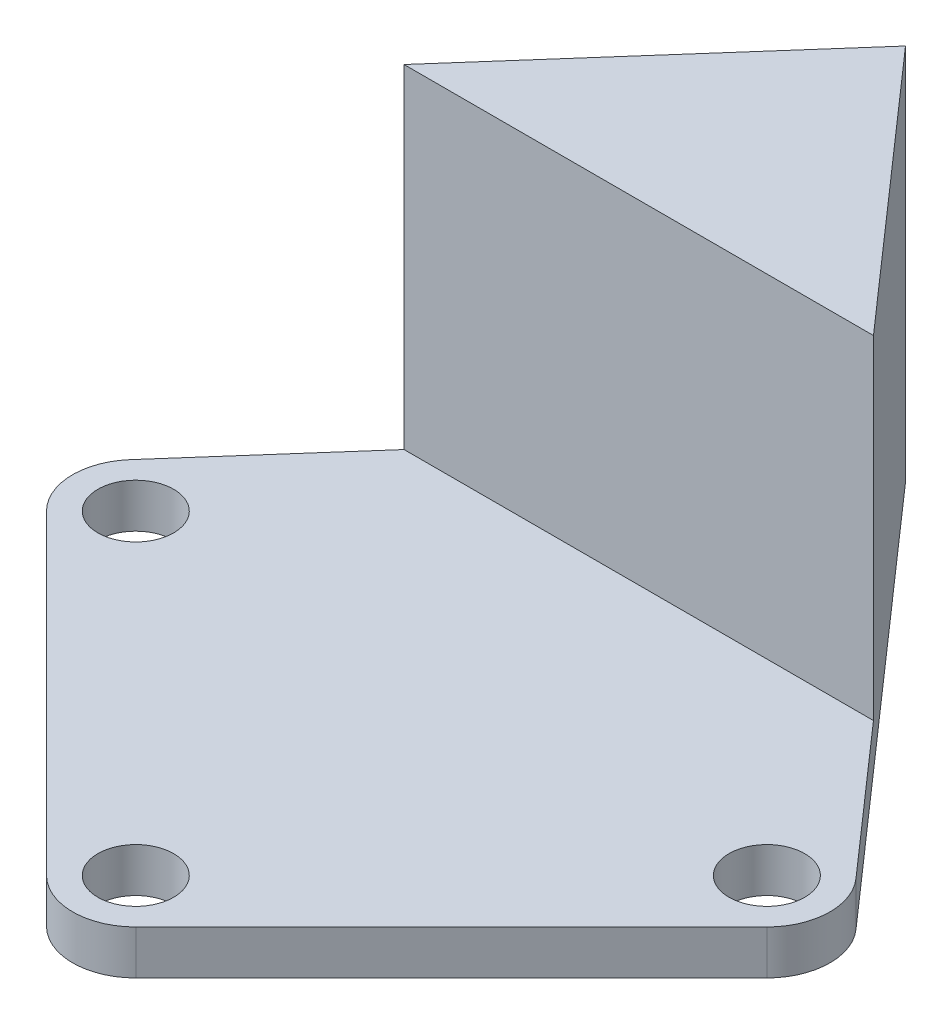
ISO-10303-21;
HEADER;
FILE_DESCRIPTION(('STEP AP214'),'2;1');
FILE_NAME('part.step','',(''),(''),'','','');
FILE_SCHEMA(('AUTOMOTIVE_DESIGN { 1 0 10303 214 1 1 1 1 }'));
ENDSEC;
DATA;
#1=APPLICATION_CONTEXT('core data for automotive mechanical design processes');
#2=APPLICATION_PROTOCOL_DEFINITION('international standard','automotive_design',2000,#1);
#3=PRODUCT_CONTEXT('',#1,'mechanical');
#4=PRODUCT('Part','Part','',(#3));
#5=PRODUCT_RELATED_PRODUCT_CATEGORY('part','',(#4));
#6=PRODUCT_DEFINITION_FORMATION('','',#4);
#7=PRODUCT_DEFINITION_CONTEXT('part definition',#1,'design');
#8=PRODUCT_DEFINITION('design','',#6,#7);
#9=PRODUCT_DEFINITION_SHAPE('','',#8);
#10=(LENGTH_UNIT() NAMED_UNIT(*) SI_UNIT(.MILLI.,.METRE.));
#11=(NAMED_UNIT(*) PLANE_ANGLE_UNIT() SI_UNIT($,.RADIAN.));
#12=(NAMED_UNIT(*) SI_UNIT($,.STERADIAN.) SOLID_ANGLE_UNIT());
#13=UNCERTAINTY_MEASURE_WITH_UNIT(LENGTH_MEASURE(1.E-05),#10,'distance_accuracy_value','');
#14=(GEOMETRIC_REPRESENTATION_CONTEXT(3) GLOBAL_UNCERTAINTY_ASSIGNED_CONTEXT((#13)) GLOBAL_UNIT_ASSIGNED_CONTEXT((#10,
#11,#12)) REPRESENTATION_CONTEXT('',''));
#15=CARTESIAN_POINT('',(0.,0.,0.));
#16=DIRECTION('',(0.,0.,1.));
#17=DIRECTION('',(1.,0.,0.));
#18=AXIS2_PLACEMENT_3D('',#15,#16,#17);
#19=CARTESIAN_POINT('',(0.,3.5,0.));
#20=DIRECTION('',(0.,1.,0.));
#21=DIRECTION('',(0.,0.,1.));
#22=AXIS2_PLACEMENT_3D('',#19,#20,#21);
#23=PLANE('',#22);
#24=CARTESIAN_POINT('',(-25.,3.5,0.));
#25=DIRECTION('',(0.,1.,0.));
#26=DIRECTION('',(0.,0.,1.));
#27=AXIS2_PLACEMENT_3D('',#24,#25,#26);
#28=CIRCLE('',#27,3.);
#29=CARTESIAN_POINT('',(-25.,3.5,3.));
#30=VERTEX_POINT('',#29);
#31=EDGE_CURVE('E181',#30,#30,#28,.T.);
#32=ORIENTED_EDGE('',*,*,#31,.F.);
#33=EDGE_LOOP('',(#32));
#34=FACE_BOUND('',#33,.T.);
#35=CARTESIAN_POINT('',(25.,3.5,0.));
#36=DIRECTION('',(0.,1.,0.));
#37=DIRECTION('',(0.,0.,1.));
#38=AXIS2_PLACEMENT_3D('',#35,#36,#37);
#39=CIRCLE('',#38,3.);
#40=CARTESIAN_POINT('',(25.,3.5,3.));
#41=VERTEX_POINT('',#40);
#42=EDGE_CURVE('E184',#41,#41,#39,.T.);
#43=ORIENTED_EDGE('',*,*,#42,.F.);
#44=EDGE_LOOP('',(#43));
#45=FACE_BOUND('',#44,.T.);
#46=CARTESIAN_POINT('',(0.,3.5,25.));
#47=DIRECTION('',(0.,1.,0.));
#48=DIRECTION('',(0.,0.,1.));
#49=AXIS2_PLACEMENT_3D('',#46,#47,#48);
#50=CIRCLE('',#49,3.);
#51=CARTESIAN_POINT('',(0.,3.5,28.));
#52=VERTEX_POINT('',#51);
#53=EDGE_CURVE('E187',#52,#52,#50,.T.);
#54=ORIENTED_EDGE('',*,*,#53,.F.);
#55=EDGE_LOOP('',(#54));
#56=FACE_BOUND('',#55,.T.);
#57=DIRECTION('',(0.660580910670077,0.,0.75075486042935));
#58=VECTOR('',#57,1.);
#59=CARTESIAN_POINT('',(17.8445958136041,3.5,-15.7012627881605));
#60=LINE('',#59,#58);
#61=CARTESIAN_POINT('',(18.594331137902,3.5,-14.8491833083262));
#62=VERTEX_POINT('',#61);
#63=CARTESIAN_POINT('',(28.7537743021467,3.5,-3.30290455335038));
#64=VERTEX_POINT('',#63);
#65=EDGE_CURVE('E174',#62,#64,#60,.T.);
#66=ORIENTED_EDGE('',*,*,#65,.F.);
#67=DIRECTION('',(-1.,0.,0.));
#68=VECTOR('',#67,1.);
#69=CARTESIAN_POINT('',(0.,3.5,-14.8491833083262));
#70=LINE('',#69,#68);
#71=CARTESIAN_POINT('',(-18.594331137902,3.50000000000001,-14.8491833083262));
#72=VERTEX_POINT('',#71);
#73=EDGE_CURVE('E158',#62,#72,#70,.T.);
#74=ORIENTED_EDGE('',*,*,#73,.T.);
#75=DIRECTION('',(0.660580910670077,0.,-0.75075486042935));
#76=VECTOR('',#75,1.);
#77=CARTESIAN_POINT('',(-17.8445958136041,3.5,-15.7012627881605));
#78=LINE('',#77,#76);
#79=CARTESIAN_POINT('',(-28.7537743021467,3.5,-3.30290455335038));
#80=VERTEX_POINT('',#79);
#81=EDGE_CURVE('E176',#80,#72,#78,.T.);
#82=ORIENTED_EDGE('',*,*,#81,.F.);
#83=CARTESIAN_POINT('',(-25.,3.5,0.));
#84=DIRECTION('',(0.,1.,0.));
#85=DIRECTION('',(0.,0.,1.));
#86=AXIS2_PLACEMENT_3D('',#83,#84,#85);
#87=CIRCLE('',#86,5.);
#88=CARTESIAN_POINT('',(-28.5355339059327,3.5,3.53553390593273));
#89=VERTEX_POINT('',#88);
#90=EDGE_CURVE('E179',#80,#89,#87,.T.);
#91=ORIENTED_EDGE('',*,*,#90,.T.);
#92=DIRECTION('',(-0.707106781186548,0.,-0.707106781186548));
#93=VECTOR('',#92,1.);
#94=CARTESIAN_POINT('',(-16.0355339059327,3.5,16.0355339059327));
#95=LINE('',#94,#93);
#96=CARTESIAN_POINT('',(-3.53553390593274,3.5,28.5355339059327));
#97=VERTEX_POINT('',#96);
#98=EDGE_CURVE('E162',#97,#89,#95,.T.);
#99=ORIENTED_EDGE('',*,*,#98,.F.);
#100=CARTESIAN_POINT('',(0.,3.5,25.));
#101=DIRECTION('',(0.,1.,0.));
#102=DIRECTION('',(0.,0.,1.));
#103=AXIS2_PLACEMENT_3D('',#100,#101,#102);
#104=CIRCLE('',#103,5.);
#105=CARTESIAN_POINT('',(3.53553390593274,3.5,28.5355339059327));
#106=VERTEX_POINT('',#105);
#107=EDGE_CURVE('E165',#97,#106,#104,.T.);
#108=ORIENTED_EDGE('',*,*,#107,.T.);
#109=DIRECTION('',(-0.707106781186548,0.,0.707106781186548));
#110=VECTOR('',#109,1.);
#111=CARTESIAN_POINT('',(16.0355339059327,3.5,16.0355339059327));
#112=LINE('',#111,#110);
#113=CARTESIAN_POINT('',(28.5355339059327,3.5,3.53553390593274));
#114=VERTEX_POINT('',#113);
#115=EDGE_CURVE('E168',#114,#106,#112,.T.);
#116=ORIENTED_EDGE('',*,*,#115,.F.);
#117=CARTESIAN_POINT('',(25.,3.5,0.));
#118=DIRECTION('',(0.,1.,0.));
#119=DIRECTION('',(0.,0.,1.));
#120=AXIS2_PLACEMENT_3D('',#117,#118,#119);
#121=CIRCLE('',#120,5.);
#122=EDGE_CURVE('E171',#114,#64,#121,.T.);
#123=ORIENTED_EDGE('',*,*,#122,.T.);
#124=EDGE_LOOP('',(#66,#74,#82,#91,#99,#108,#116,#123));
#125=FACE_BOUND('',#124,.T.);
#126=ADVANCED_FACE('F35',(#34,#45,#56,#125),#23,.T.);
#127=CARTESIAN_POINT('',(-16.0355339059327,3.5,16.0355339059327));
#128=DIRECTION('',(-0.707106781186547,0.,0.707106781186547));
#129=DIRECTION('',(0.707106781186548,0.,0.707106781186548));
#130=AXIS2_PLACEMENT_3D('',#127,#128,#129);
#131=PLANE('',#130);
#132=DIRECTION('',(-0.707106781186548,0.,-0.707106781186548));
#133=VECTOR('',#132,1.);
#134=CARTESIAN_POINT('',(-16.0355339059327,0.,16.0355339059327));
#135=LINE('',#134,#133);
#136=CARTESIAN_POINT('',(-3.53553390593274,0.,28.5355339059327));
#137=VERTEX_POINT('',#136);
#138=CARTESIAN_POINT('',(-28.5355339059327,0.,3.53553390593273));
#139=VERTEX_POINT('',#138);
#140=EDGE_CURVE('E161',#137,#139,#135,.T.);
#141=ORIENTED_EDGE('',*,*,#140,.F.);
#142=DIRECTION('',(0.,-1.,0.));
#143=VECTOR('',#142,1.);
#144=CARTESIAN_POINT('',(-3.53553390593274,3.5,28.5355339059327));
#145=LINE('',#144,#143);
#146=EDGE_CURVE('E230',#97,#137,#145,.T.);
#147=ORIENTED_EDGE('',*,*,#146,.F.);
#148=ORIENTED_EDGE('',*,*,#98,.T.);
#149=DIRECTION('',(0.,-1.,0.));
#150=VECTOR('',#149,1.);
#151=CARTESIAN_POINT('',(-28.5355339059327,3.5,3.53553390593273));
#152=LINE('',#151,#150);
#153=EDGE_CURVE('E190',#89,#139,#152,.T.);
#154=ORIENTED_EDGE('',*,*,#153,.T.);
#155=EDGE_LOOP('',(#141,#147,#148,#154));
#156=FACE_BOUND('',#155,.T.);
#157=ADVANCED_FACE('F37',(#156),#131,.T.);
#158=CARTESIAN_POINT('',(0.,3.5,25.));
#159=DIRECTION('',(0.,-1.,0.));
#160=DIRECTION('',(0.,0.,-1.));
#161=AXIS2_PLACEMENT_3D('',#158,#159,#160);
#162=CYLINDRICAL_SURFACE('',#161,5.);
#163=CARTESIAN_POINT('',(0.,0.,25.));
#164=DIRECTION('',(0.,1.,0.));
#165=DIRECTION('',(0.,0.,1.));
#166=AXIS2_PLACEMENT_3D('',#163,#164,#165);
#167=CIRCLE('',#166,5.);
#168=CARTESIAN_POINT('',(3.53553390593274,0.,28.5355339059327));
#169=VERTEX_POINT('',#168);
#170=EDGE_CURVE('E193',#137,#169,#167,.T.);
#171=ORIENTED_EDGE('',*,*,#170,.T.);
#172=DIRECTION('',(0.,-1.,0.));
#173=VECTOR('',#172,1.);
#174=CARTESIAN_POINT('',(3.53553390593274,3.5,28.5355339059327));
#175=LINE('',#174,#173);
#176=EDGE_CURVE('E228',#106,#169,#175,.T.);
#177=ORIENTED_EDGE('',*,*,#176,.F.);
#178=ORIENTED_EDGE('',*,*,#107,.F.);
#179=ORIENTED_EDGE('',*,*,#146,.T.);
#180=EDGE_LOOP('',(#171,#177,#178,#179));
#181=FACE_BOUND('',#180,.T.);
#182=ADVANCED_FACE('F254',(#181),#162,.T.);
#183=CARTESIAN_POINT('',(16.0355339059327,3.5,16.0355339059327));
#184=DIRECTION('',(0.707106781186547,0.,0.707106781186547));
#185=DIRECTION('',(0.707106781186548,0.,-0.707106781186548));
#186=AXIS2_PLACEMENT_3D('',#183,#184,#185);
#187=PLANE('',#186);
#188=DIRECTION('',(-0.707106781186548,0.,0.707106781186548));
#189=VECTOR('',#188,1.);
#190=CARTESIAN_POINT('',(16.0355339059327,0.,16.0355339059327));
#191=LINE('',#190,#189);
#192=CARTESIAN_POINT('',(28.5355339059327,0.,3.53553390593274));
#193=VERTEX_POINT('',#192);
#194=EDGE_CURVE('E196',#193,#169,#191,.T.);
#195=ORIENTED_EDGE('',*,*,#194,.F.);
#196=DIRECTION('',(0.,-1.,0.));
#197=VECTOR('',#196,1.);
#198=CARTESIAN_POINT('',(28.5355339059327,3.5,3.53553390593274));
#199=LINE('',#198,#197);
#200=EDGE_CURVE('E226',#114,#193,#199,.T.);
#201=ORIENTED_EDGE('',*,*,#200,.F.);
#202=ORIENTED_EDGE('',*,*,#115,.T.);
#203=ORIENTED_EDGE('',*,*,#176,.T.);
#204=EDGE_LOOP('',(#195,#201,#202,#203));
#205=FACE_BOUND('',#204,.T.);
#206=ADVANCED_FACE('F290',(#205),#187,.T.);
#207=CARTESIAN_POINT('',(25.,3.5,0.));
#208=DIRECTION('',(0.,-1.,0.));
#209=DIRECTION('',(0.,0.,-1.));
#210=AXIS2_PLACEMENT_3D('',#207,#208,#209);
#211=CYLINDRICAL_SURFACE('',#210,5.);
#212=CARTESIAN_POINT('',(25.,0.,0.));
#213=DIRECTION('',(0.,1.,0.));
#214=DIRECTION('',(0.,0.,1.));
#215=AXIS2_PLACEMENT_3D('',#212,#213,#214);
#216=CIRCLE('',#215,5.);
#217=CARTESIAN_POINT('',(28.7537743021467,0.,-3.30290455335038));
#218=VERTEX_POINT('',#217);
#219=EDGE_CURVE('E199',#193,#218,#216,.T.);
#220=ORIENTED_EDGE('',*,*,#219,.T.);
#221=DIRECTION('',(0.,-1.,0.));
#222=VECTOR('',#221,1.);
#223=CARTESIAN_POINT('',(28.7537743021467,3.5,-3.30290455335038));
#224=LINE('',#223,#222);
#225=EDGE_CURVE('E223',#64,#218,#224,.T.);
#226=ORIENTED_EDGE('',*,*,#225,.F.);
#227=ORIENTED_EDGE('',*,*,#122,.F.);
#228=ORIENTED_EDGE('',*,*,#200,.T.);
#229=EDGE_LOOP('',(#220,#226,#227,#228));
#230=FACE_BOUND('',#229,.T.);
#231=ADVANCED_FACE('F287',(#230),#211,.T.);
#232=CARTESIAN_POINT('',(17.8445958136041,3.5,-15.7012627881605));
#233=DIRECTION('',(0.75075486042935,0.,-0.660580910670077));
#234=DIRECTION('',(-0.660580910670077,0.,-0.75075486042935));
#235=AXIS2_PLACEMENT_3D('',#232,#233,#234);
#236=PLANE('',#235);
#237=DIRECTION('',(0.,-1.,0.));
#238=VECTOR('',#237,1.);
#239=CARTESIAN_POINT('',(18.594331137902,29.918114597563,-14.8491833083262));
#240=LINE('',#239,#238);
#241=CARTESIAN_POINT('',(18.594331137902,29.918114597563,-14.8491833083262));
#242=VERTEX_POINT('',#241);
#243=EDGE_CURVE('E58',#242,#62,#240,.T.);
#244=ORIENTED_EDGE('',*,*,#243,.T.);
#245=ORIENTED_EDGE('',*,*,#65,.T.);
#246=ORIENTED_EDGE('',*,*,#225,.T.);
#247=DIRECTION('',(0.660580910670077,0.,0.75075486042935));
#248=VECTOR('',#247,1.);
#249=CARTESIAN_POINT('',(17.8445958136041,0.,-15.7012627881605));
#250=LINE('',#249,#248);
#251=CARTESIAN_POINT('',(0.,0.,-35.9817716903493));
#252=VERTEX_POINT('',#251);
#253=EDGE_CURVE('E202',#252,#218,#250,.T.);
#254=ORIENTED_EDGE('',*,*,#253,.F.);
#255=DIRECTION('',(0.,-1.,0.));
#256=VECTOR('',#255,1.);
#257=CARTESIAN_POINT('',(0.,3.5,-35.9817716903493));
#258=LINE('',#257,#256);
#259=CARTESIAN_POINT('',(0.,29.918114597563,-35.9817716903493));
#260=VERTEX_POINT('',#259);
#261=EDGE_CURVE('E220',#260,#252,#258,.T.);
#262=ORIENTED_EDGE('',*,*,#261,.F.);
#263=DIRECTION('',(0.660580910670077,0.,0.75075486042935));
#264=VECTOR('',#263,1.);
#265=CARTESIAN_POINT('',(17.8445958136041,29.918114597563,-15.7012627881605));
#266=LINE('',#265,#264);
#267=EDGE_CURVE('E153',#260,#242,#266,.T.);
#268=ORIENTED_EDGE('',*,*,#267,.T.);
#269=EDGE_LOOP('',(#244,#245,#246,#254,#262,#268));
#270=FACE_BOUND('',#269,.T.);
#271=ADVANCED_FACE('F283',(#270),#236,.T.);
#272=CARTESIAN_POINT('',(-17.8445958136041,3.5,-15.7012627881605));
#273=DIRECTION('',(-0.75075486042935,0.,-0.660580910670077));
#274=DIRECTION('',(-0.660580910670077,0.,0.75075486042935));
#275=AXIS2_PLACEMENT_3D('',#272,#273,#274);
#276=PLANE('',#275);
#277=ORIENTED_EDGE('',*,*,#261,.T.);
#278=DIRECTION('',(0.660580910670077,0.,-0.75075486042935));
#279=VECTOR('',#278,1.);
#280=CARTESIAN_POINT('',(-17.8445958136041,0.,-15.7012627881605));
#281=LINE('',#280,#279);
#282=CARTESIAN_POINT('',(-28.7537743021467,0.,-3.30290455335038));
#283=VERTEX_POINT('',#282);
#284=EDGE_CURVE('E204',#283,#252,#281,.T.);
#285=ORIENTED_EDGE('',*,*,#284,.F.);
#286=DIRECTION('',(0.,-1.,0.));
#287=VECTOR('',#286,1.);
#288=CARTESIAN_POINT('',(-28.7537743021467,3.5,-3.30290455335038));
#289=LINE('',#288,#287);
#290=EDGE_CURVE('E218',#80,#283,#289,.T.);
#291=ORIENTED_EDGE('',*,*,#290,.F.);
#292=ORIENTED_EDGE('',*,*,#81,.T.);
#293=DIRECTION('',(0.,-1.,0.));
#294=VECTOR('',#293,1.);
#295=CARTESIAN_POINT('',(-18.594331137902,29.918114597563,-14.8491833083262));
#296=LINE('',#295,#294);
#297=CARTESIAN_POINT('',(-18.594331137902,29.918114597563,-14.8491833083262));
#298=VERTEX_POINT('',#297);
#299=EDGE_CURVE('E156',#298,#72,#296,.T.);
#300=ORIENTED_EDGE('',*,*,#299,.F.);
#301=DIRECTION('',(0.660580910670077,0.,-0.75075486042935));
#302=VECTOR('',#301,1.);
#303=CARTESIAN_POINT('',(-17.8445958136041,29.918114597563,-15.7012627881605));
#304=LINE('',#303,#302);
#305=EDGE_CURVE('E147',#298,#260,#304,.T.);
#306=ORIENTED_EDGE('',*,*,#305,.T.);
#307=EDGE_LOOP('',(#277,#285,#291,#292,#300,#306));
#308=FACE_BOUND('',#307,.T.);
#309=ADVANCED_FACE('F273',(#308),#276,.T.);
#310=CARTESIAN_POINT('',(25.,3.5,0.));
#311=DIRECTION('',(0.,-1.,0.));
#312=DIRECTION('',(0.,0.,-1.));
#313=AXIS2_PLACEMENT_3D('',#310,#311,#312);
#314=CYLINDRICAL_SURFACE('',#313,3.);
#315=ORIENTED_EDGE('',*,*,#42,.T.);
#316=EDGE_LOOP('',(#315));
#317=FACE_BOUND('',#316,.T.);
#318=CARTESIAN_POINT('',(25.,0.,0.));
#319=DIRECTION('',(0.,1.,0.));
#320=DIRECTION('',(0.,0.,1.));
#321=AXIS2_PLACEMENT_3D('',#318,#319,#320);
#322=CIRCLE('',#321,3.);
#323=CARTESIAN_POINT('',(25.,0.,3.));
#324=VERTEX_POINT('',#323);
#325=EDGE_CURVE('E212',#324,#324,#322,.T.);
#326=ORIENTED_EDGE('',*,*,#325,.F.);
#327=EDGE_LOOP('',(#326));
#328=FACE_BOUND('',#327,.T.);
#329=ADVANCED_FACE('F269',(#317,#328),#314,.F.);
#330=CARTESIAN_POINT('',(-25.,3.5,0.));
#331=DIRECTION('',(0.,-1.,0.));
#332=DIRECTION('',(0.,0.,-1.));
#333=AXIS2_PLACEMENT_3D('',#330,#331,#332);
#334=CYLINDRICAL_SURFACE('',#333,3.);
#335=ORIENTED_EDGE('',*,*,#31,.T.);
#336=EDGE_LOOP('',(#335));
#337=FACE_BOUND('',#336,.T.);
#338=CARTESIAN_POINT('',(-25.,0.,0.));
#339=DIRECTION('',(0.,1.,0.));
#340=DIRECTION('',(0.,0.,1.));
#341=AXIS2_PLACEMENT_3D('',#338,#339,#340);
#342=CIRCLE('',#341,3.);
#343=CARTESIAN_POINT('',(-25.,0.,3.));
#344=VERTEX_POINT('',#343);
#345=EDGE_CURVE('E209',#344,#344,#342,.T.);
#346=ORIENTED_EDGE('',*,*,#345,.F.);
#347=EDGE_LOOP('',(#346));
#348=FACE_BOUND('',#347,.T.);
#349=ADVANCED_FACE('F272',(#337,#348),#334,.F.);
#350=CARTESIAN_POINT('',(-25.,3.5,0.));
#351=DIRECTION('',(0.,-1.,0.));
#352=DIRECTION('',(0.,0.,-1.));
#353=AXIS2_PLACEMENT_3D('',#350,#351,#352);
#354=CYLINDRICAL_SURFACE('',#353,5.);
#355=CARTESIAN_POINT('',(-25.,0.,0.));
#356=DIRECTION('',(0.,1.,0.));
#357=DIRECTION('',(0.,0.,1.));
#358=AXIS2_PLACEMENT_3D('',#355,#356,#357);
#359=CIRCLE('',#358,5.);
#360=EDGE_CURVE('E206',#283,#139,#359,.T.);
#361=ORIENTED_EDGE('',*,*,#360,.T.);
#362=ORIENTED_EDGE('',*,*,#153,.F.);
#363=ORIENTED_EDGE('',*,*,#90,.F.);
#364=ORIENTED_EDGE('',*,*,#290,.T.);
#365=EDGE_LOOP('',(#361,#362,#363,#364));
#366=FACE_BOUND('',#365,.T.);
#367=ADVANCED_FACE('F267',(#366),#354,.T.);
#368=CARTESIAN_POINT('',(0.,3.5,25.));
#369=DIRECTION('',(0.,-1.,0.));
#370=DIRECTION('',(0.,0.,-1.));
#371=AXIS2_PLACEMENT_3D('',#368,#369,#370);
#372=CYLINDRICAL_SURFACE('',#371,3.);
#373=ORIENTED_EDGE('',*,*,#53,.T.);
#374=EDGE_LOOP('',(#373));
#375=FACE_BOUND('',#374,.T.);
#376=CARTESIAN_POINT('',(0.,0.,25.));
#377=DIRECTION('',(0.,1.,0.));
#378=DIRECTION('',(0.,0.,1.));
#379=AXIS2_PLACEMENT_3D('',#376,#377,#378);
#380=CIRCLE('',#379,3.);
#381=CARTESIAN_POINT('',(0.,0.,28.));
#382=VERTEX_POINT('',#381);
#383=EDGE_CURVE('E166',#382,#382,#380,.T.);
#384=ORIENTED_EDGE('',*,*,#383,.F.);
#385=EDGE_LOOP('',(#384));
#386=FACE_BOUND('',#385,.T.);
#387=ADVANCED_FACE('F264',(#375,#386),#372,.F.);
#388=CARTESIAN_POINT('',(0.,0.,0.));
#389=DIRECTION('',(0.,1.,0.));
#390=DIRECTION('',(0.,0.,1.));
#391=AXIS2_PLACEMENT_3D('',#388,#389,#390);
#392=PLANE('',#391);
#393=DIRECTION('',(-0.660580910670076,0.,0.75075486042935));
#394=VECTOR('',#393,1.);
#395=CARTESIAN_POINT('',(-15.592331232316,0.,-13.7195200561503));
#396=LINE('',#395,#394);
#397=CARTESIAN_POINT('',(0.,0.,-31.4403143888405));
#398=VERTEX_POINT('',#397);
#399=CARTESIAN_POINT('',(-11.9586861429948,0.,-17.8491833083262));
#400=VERTEX_POINT('',#399);
#401=EDGE_CURVE('E43',#398,#400,#396,.T.);
#402=ORIENTED_EDGE('',*,*,#401,.T.);
#403=DIRECTION('',(1.,0.,0.));
#404=VECTOR('',#403,1.);
#405=CARTESIAN_POINT('',(0.,0.,-17.8491833083262));
#406=LINE('',#405,#404);
#407=CARTESIAN_POINT('',(11.9586861429948,0.,-17.8491833083262));
#408=VERTEX_POINT('',#407);
#409=EDGE_CURVE('E11',#400,#408,#406,.T.);
#410=ORIENTED_EDGE('',*,*,#409,.T.);
#411=DIRECTION('',(-0.660580910670076,0.,-0.75075486042935));
#412=VECTOR('',#411,1.);
#413=CARTESIAN_POINT('',(15.592331232316,0.,-13.7195200561503));
#414=LINE('',#413,#412);
#415=EDGE_CURVE('E129',#408,#398,#414,.T.);
#416=ORIENTED_EDGE('',*,*,#415,.T.);
#417=EDGE_LOOP('',(#402,#410,#416));
#418=FACE_BOUND('',#417,.T.);
#419=ORIENTED_EDGE('',*,*,#253,.T.);
#420=ORIENTED_EDGE('',*,*,#219,.F.);
#421=ORIENTED_EDGE('',*,*,#194,.T.);
#422=ORIENTED_EDGE('',*,*,#170,.F.);
#423=ORIENTED_EDGE('',*,*,#140,.T.);
#424=ORIENTED_EDGE('',*,*,#360,.F.);
#425=ORIENTED_EDGE('',*,*,#284,.T.);
#426=EDGE_LOOP('',(#419,#420,#421,#422,#423,#424,#425));
#427=FACE_BOUND('',#426,.T.);
#428=ORIENTED_EDGE('',*,*,#383,.T.);
#429=EDGE_LOOP('',(#428));
#430=FACE_BOUND('',#429,.T.);
#431=ORIENTED_EDGE('',*,*,#325,.T.);
#432=EDGE_LOOP('',(#431));
#433=FACE_BOUND('',#432,.T.);
#434=ORIENTED_EDGE('',*,*,#345,.T.);
#435=EDGE_LOOP('',(#434));
#436=FACE_BOUND('',#435,.T.);
#437=ADVANCED_FACE('F234',(#418,#427,#430,#433,#436),#392,.F.);
#438=CARTESIAN_POINT('',(0.,29.918114597563,-14.8491833083262));
#439=DIRECTION('',(0.,0.,-1.));
#440=DIRECTION('',(-1.,0.,0.));
#441=AXIS2_PLACEMENT_3D('',#438,#439,#440);
#442=PLANE('',#441);
#443=ORIENTED_EDGE('',*,*,#73,.F.);
#444=ORIENTED_EDGE('',*,*,#243,.F.);
#445=DIRECTION('',(1.,0.,0.));
#446=VECTOR('',#445,1.);
#447=CARTESIAN_POINT('',(0.,29.918114597563,-14.8491833083262));
#448=LINE('',#447,#446);
#449=EDGE_CURVE('E151',#298,#242,#448,.T.);
#450=ORIENTED_EDGE('',*,*,#449,.F.);
#451=ORIENTED_EDGE('',*,*,#299,.T.);
#452=EDGE_LOOP('',(#443,#444,#450,#451));
#453=FACE_BOUND('',#452,.T.);
#454=ADVANCED_FACE('F260',(#453),#442,.F.);
#455=CARTESIAN_POINT('',(0.,29.918114597563,0.));
#456=DIRECTION('',(0.,1.,0.));
#457=DIRECTION('',(0.,0.,1.));
#458=AXIS2_PLACEMENT_3D('',#455,#456,#457);
#459=PLANE('',#458);
#460=ORIENTED_EDGE('',*,*,#305,.F.);
#461=ORIENTED_EDGE('',*,*,#449,.T.);
#462=ORIENTED_EDGE('',*,*,#267,.F.);
#463=EDGE_LOOP('',(#460,#461,#462));
#464=FACE_BOUND('',#463,.T.);
#465=ADVANCED_FACE('F245',(#464),#459,.T.);
#466=CARTESIAN_POINT('',(0.,-2.08188540243698,-17.8491833083262));
#467=DIRECTION('',(0.,0.,1.));
#468=DIRECTION('',(1.,0.,0.));
#469=AXIS2_PLACEMENT_3D('',#466,#467,#468);
#470=PLANE('',#469);
#471=DIRECTION('',(0.,1.,0.));
#472=VECTOR('',#471,1.);
#473=CARTESIAN_POINT('',(-11.9586861429948,-2.08188540243698,-17.8491833083262));
#474=LINE('',#473,#472);
#475=CARTESIAN_POINT('',(-11.9586861429948,26.418114597563,-17.8491833083262));
#476=VERTEX_POINT('',#475);
#477=EDGE_CURVE('E142',#400,#476,#474,.T.);
#478=ORIENTED_EDGE('',*,*,#477,.T.);
#479=DIRECTION('',(1.,0.,0.));
#480=VECTOR('',#479,1.);
#481=CARTESIAN_POINT('',(0.,26.418114597563,-17.8491833083262));
#482=LINE('',#481,#480);
#483=CARTESIAN_POINT('',(11.9586861429948,26.418114597563,-17.8491833083262));
#484=VERTEX_POINT('',#483);
#485=EDGE_CURVE('E137',#476,#484,#482,.T.);
#486=ORIENTED_EDGE('',*,*,#485,.T.);
#487=DIRECTION('',(0.,1.,0.));
#488=VECTOR('',#487,1.);
#489=CARTESIAN_POINT('',(11.9586861429948,-2.08188540243698,-17.8491833083262));
#490=LINE('',#489,#488);
#491=EDGE_CURVE('E123',#408,#484,#490,.T.);
#492=ORIENTED_EDGE('',*,*,#491,.F.);
#493=ORIENTED_EDGE('',*,*,#409,.F.);
#494=EDGE_LOOP('',(#478,#486,#492,#493));
#495=FACE_BOUND('',#494,.T.);
#496=ADVANCED_FACE('F140',(#495),#470,.F.);
#497=CARTESIAN_POINT('',(-15.592331232316,-2.08188540243698,-13.7195200561503));
#498=DIRECTION('',(-0.75075486042935,0.,-0.660580910670076));
#499=DIRECTION('',(-0.660580910670076,0.,0.75075486042935));
#500=AXIS2_PLACEMENT_3D('',#497,#498,#499);
#501=PLANE('',#500);
#502=DIRECTION('',(0.,1.,0.));
#503=VECTOR('',#502,1.);
#504=CARTESIAN_POINT('',(0.,-2.08188540243698,-31.4403143888405));
#505=LINE('',#504,#503);
#506=CARTESIAN_POINT('',(0.,26.418114597563,-31.4403143888405));
#507=VERTEX_POINT('',#506);
#508=EDGE_CURVE('E50',#398,#507,#505,.T.);
#509=ORIENTED_EDGE('',*,*,#508,.T.);
#510=DIRECTION('',(-0.660580910670076,0.,0.75075486042935));
#511=VECTOR('',#510,1.);
#512=CARTESIAN_POINT('',(-15.592331232316,26.418114597563,-13.7195200561503));
#513=LINE('',#512,#511);
#514=EDGE_CURVE('E132',#507,#476,#513,.T.);
#515=ORIENTED_EDGE('',*,*,#514,.T.);
#516=ORIENTED_EDGE('',*,*,#477,.F.);
#517=ORIENTED_EDGE('',*,*,#401,.F.);
#518=EDGE_LOOP('',(#509,#515,#516,#517));
#519=FACE_BOUND('',#518,.T.);
#520=ADVANCED_FACE('F237',(#519),#501,.F.);
#521=CARTESIAN_POINT('',(15.592331232316,-2.08188540243698,-13.7195200561503));
#522=DIRECTION('',(0.75075486042935,0.,-0.660580910670076));
#523=DIRECTION('',(-0.660580910670076,0.,-0.75075486042935));
#524=AXIS2_PLACEMENT_3D('',#521,#522,#523);
#525=PLANE('',#524);
#526=ORIENTED_EDGE('',*,*,#491,.T.);
#527=DIRECTION('',(-0.660580910670076,0.,-0.75075486042935));
#528=VECTOR('',#527,1.);
#529=CARTESIAN_POINT('',(15.592331232316,26.418114597563,-13.7195200561503));
#530=LINE('',#529,#528);
#531=EDGE_CURVE('E126',#484,#507,#530,.T.);
#532=ORIENTED_EDGE('',*,*,#531,.T.);
#533=ORIENTED_EDGE('',*,*,#508,.F.);
#534=ORIENTED_EDGE('',*,*,#415,.F.);
#535=EDGE_LOOP('',(#526,#532,#533,#534));
#536=FACE_BOUND('',#535,.T.);
#537=ADVANCED_FACE('F125',(#536),#525,.F.);
#538=CARTESIAN_POINT('',(0.,26.418114597563,0.));
#539=DIRECTION('',(0.,1.,0.));
#540=DIRECTION('',(0.,0.,1.));
#541=AXIS2_PLACEMENT_3D('',#538,#539,#540);
#542=PLANE('',#541);
#543=ORIENTED_EDGE('',*,*,#485,.F.);
#544=ORIENTED_EDGE('',*,*,#514,.F.);
#545=ORIENTED_EDGE('',*,*,#531,.F.);
#546=EDGE_LOOP('',(#543,#544,#545));
#547=FACE_BOUND('',#546,.T.);
#548=ADVANCED_FACE('F136',(#547),#542,.F.);
#549=CLOSED_SHELL('',(#126,#157,#182,#206,#231,#271,#309,#329,#349,#367,#387,#437,#454,#465,
#496,#520,#537,#548));
#550=MANIFOLD_SOLID_BREP('B2',#549);
#551=ADVANCED_BREP_SHAPE_REPRESENTATION('',(#18,#550),#14);
#552=SHAPE_DEFINITION_REPRESENTATION(#9,#551);
ENDSEC;
END-ISO-10303-21;
